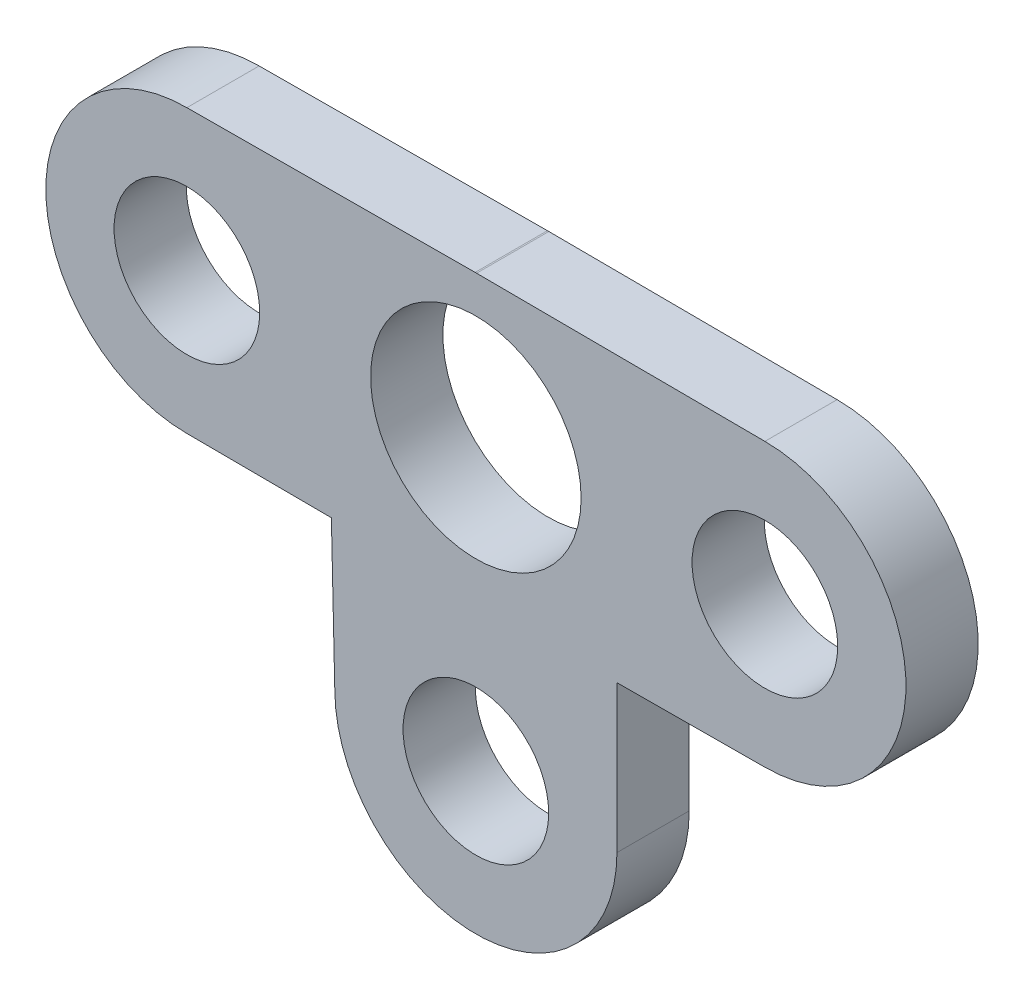
ISO-10303-21;
HEADER;
FILE_DESCRIPTION(('STEP AP214'),'2;1');
FILE_NAME('part.step','',(''),(''),'','','');
FILE_SCHEMA(('AUTOMOTIVE_DESIGN { 1 0 10303 214 1 1 1 1 }'));
ENDSEC;
DATA;
#1=APPLICATION_CONTEXT('core data for automotive mechanical design processes');
#2=APPLICATION_PROTOCOL_DEFINITION('international standard','automotive_design',2000,#1);
#3=PRODUCT_CONTEXT('',#1,'mechanical');
#4=PRODUCT('Part','Part','',(#3));
#5=PRODUCT_RELATED_PRODUCT_CATEGORY('part','',(#4));
#6=PRODUCT_DEFINITION_FORMATION('','',#4);
#7=PRODUCT_DEFINITION_CONTEXT('part definition',#1,'design');
#8=PRODUCT_DEFINITION('design','',#6,#7);
#9=PRODUCT_DEFINITION_SHAPE('','',#8);
#10=(LENGTH_UNIT() NAMED_UNIT(*) SI_UNIT(.MILLI.,.METRE.));
#11=(NAMED_UNIT(*) PLANE_ANGLE_UNIT() SI_UNIT($,.RADIAN.));
#12=(NAMED_UNIT(*) SI_UNIT($,.STERADIAN.) SOLID_ANGLE_UNIT());
#13=UNCERTAINTY_MEASURE_WITH_UNIT(LENGTH_MEASURE(1.E-05),#10,'distance_accuracy_value','');
#14=(GEOMETRIC_REPRESENTATION_CONTEXT(3) GLOBAL_UNCERTAINTY_ASSIGNED_CONTEXT((#13)) GLOBAL_UNIT_ASSIGNED_CONTEXT((#10,
#11,#12)) REPRESENTATION_CONTEXT('',''));
#15=CARTESIAN_POINT('',(0.,0.,0.));
#16=DIRECTION('',(0.,0.,1.));
#17=DIRECTION('',(1.,0.,0.));
#18=AXIS2_PLACEMENT_3D('',#15,#16,#17);
#19=CARTESIAN_POINT('',(-0.0321051201345869,-6.26491773778883,3.175));
#20=DIRECTION('',(-0.00512452037263956,-0.999986869559271,0.));
#21=DIRECTION('',(0.999986869559271,-0.00512452037263956,0.));
#22=AXIS2_PLACEMENT_3D('',#19,#20,#21);
#23=PLANE('',#22);
#24=DIRECTION('',(-0.999986869559271,0.00512452037263957,0.));
#25=VECTOR('',#24,1.);
#26=CARTESIAN_POINT('',(-0.0321051201345869,-6.26491773778883,0.));
#27=LINE('',#26,#25);
#28=CARTESIAN_POINT('',(-6.3500000000002,-6.23254113164566,0.));
#29=VERTEX_POINT('',#28);
#30=CARTESIAN_POINT('',(-12.7,-6.2,0.));
#31=VERTEX_POINT('',#30);
#32=EDGE_CURVE('E174',#29,#31,#27,.T.);
#33=ORIENTED_EDGE('',*,*,#32,.F.);
#34=CARTESIAN_POINT('',(-6.35000000000019,-6.23254113164566,3.175));
#35=DIRECTION('',(0.,0.,-1.));
#36=VECTOR('',#35,1.);
#37=LINE('',#34,#36);
#38=CARTESIAN_POINT('',(-6.3500000000002,-6.23254113164566,3.175));
#39=VERTEX_POINT('',#38);
#40=EDGE_CURVE('E11',#39,#29,#37,.T.);
#41=ORIENTED_EDGE('',*,*,#40,.F.);
#42=DIRECTION('',(-0.999986869559271,0.00512452037263957,0.));
#43=VECTOR('',#42,1.);
#44=CARTESIAN_POINT('',(-0.0321051201345869,-6.26491773778883,3.175));
#45=LINE('',#44,#43);
#46=CARTESIAN_POINT('',(-12.7,-6.2,3.175));
#47=VERTEX_POINT('',#46);
#48=EDGE_CURVE('E227',#39,#47,#45,.T.);
#49=ORIENTED_EDGE('',*,*,#48,.T.);
#50=DIRECTION('',(0.,0.,-1.));
#51=VECTOR('',#50,1.);
#52=CARTESIAN_POINT('',(-12.7,-6.2,3.175));
#53=LINE('',#52,#51);
#54=EDGE_CURVE('E105',#47,#31,#53,.T.);
#55=ORIENTED_EDGE('',*,*,#54,.T.);
#56=EDGE_LOOP('',(#33,#41,#49,#55));
#57=FACE_BOUND('',#56,.T.);
#58=ADVANCED_FACE('F45',(#57),#23,.T.);
#59=CARTESIAN_POINT('',(-6.49105989406454,-0.150547379415907,3.175));
#60=DIRECTION('',(-0.99973115002271,-0.0231867995693576,0.));
#61=DIRECTION('',(0.0231867995693576,-0.99973115002271,0.));
#62=AXIS2_PLACEMENT_3D('',#59,#60,#61);
#63=PLANE('',#62);
#64=DIRECTION('',(-0.0231867995693576,0.99973115002271,0.));
#65=VECTOR('',#64,1.);
#66=CARTESIAN_POINT('',(-6.49105989406454,-0.150547379415907,0.));
#67=LINE('',#66,#65);
#68=CARTESIAN_POINT('',(-6.2,-12.7,0.));
#69=VERTEX_POINT('',#68);
#70=EDGE_CURVE('E178',#69,#29,#67,.T.);
#71=ORIENTED_EDGE('',*,*,#70,.F.);
#72=DIRECTION('',(0.,0.,-1.));
#73=VECTOR('',#72,1.);
#74=CARTESIAN_POINT('',(-6.2,-12.7,3.175));
#75=LINE('',#74,#73);
#76=CARTESIAN_POINT('',(-6.2,-12.7,3.175));
#77=VERTEX_POINT('',#76);
#78=EDGE_CURVE('E57',#77,#69,#75,.T.);
#79=ORIENTED_EDGE('',*,*,#78,.F.);
#80=DIRECTION('',(-0.0231867995693576,0.99973115002271,0.));
#81=VECTOR('',#80,1.);
#82=CARTESIAN_POINT('',(-6.49105989406454,-0.150547379415907,3.175));
#83=LINE('',#82,#81);
#84=EDGE_CURVE('E324',#77,#39,#83,.T.);
#85=ORIENTED_EDGE('',*,*,#84,.T.);
#86=ORIENTED_EDGE('',*,*,#40,.T.);
#87=EDGE_LOOP('',(#71,#79,#85,#86));
#88=FACE_BOUND('',#87,.T.);
#89=ADVANCED_FACE('F257',(#88),#63,.T.);
#90=CARTESIAN_POINT('',(0.,-12.7,3.175));
#91=DIRECTION('',(0.,0.,-1.));
#92=DIRECTION('',(-1.,0.,0.));
#93=AXIS2_PLACEMENT_3D('',#90,#91,#92);
#94=CYLINDRICAL_SURFACE('',#93,6.2);
#95=CARTESIAN_POINT('',(0.,-12.7,0.));
#96=DIRECTION('',(0.,0.,1.));
#97=DIRECTION('',(1.,0.,0.));
#98=AXIS2_PLACEMENT_3D('',#95,#96,#97);
#99=CIRCLE('',#98,6.2);
#100=CARTESIAN_POINT('',(6.2,-12.7,0.));
#101=VERTEX_POINT('',#100);
#102=EDGE_CURVE('E184',#69,#101,#99,.T.);
#103=ORIENTED_EDGE('',*,*,#102,.T.);
#104=DIRECTION('',(0.,0.,-1.));
#105=VECTOR('',#104,1.);
#106=CARTESIAN_POINT('',(6.2,-12.7,3.175));
#107=LINE('',#106,#105);
#108=CARTESIAN_POINT('',(6.2,-12.7,3.175));
#109=VERTEX_POINT('',#108);
#110=EDGE_CURVE('E245',#109,#101,#107,.T.);
#111=ORIENTED_EDGE('',*,*,#110,.F.);
#112=CARTESIAN_POINT('',(0.,-12.7,3.175));
#113=DIRECTION('',(0.,0.,1.));
#114=DIRECTION('',(1.,0.,0.));
#115=AXIS2_PLACEMENT_3D('',#112,#113,#114);
#116=CIRCLE('',#115,6.2);
#117=EDGE_CURVE('E326',#77,#109,#116,.T.);
#118=ORIENTED_EDGE('',*,*,#117,.F.);
#119=ORIENTED_EDGE('',*,*,#78,.T.);
#120=EDGE_LOOP('',(#103,#111,#118,#119));
#121=FACE_BOUND('',#120,.T.);
#122=ADVANCED_FACE('F266',(#121),#94,.T.);
#123=CARTESIAN_POINT('',(6.2,0.,3.175));
#124=DIRECTION('',(-1.,0.,0.));
#125=DIRECTION('',(0.,-1.,0.));
#126=AXIS2_PLACEMENT_3D('',#123,#124,#125);
#127=PLANE('',#126);
#128=DIRECTION('',(0.,1.,0.));
#129=VECTOR('',#128,1.);
#130=CARTESIAN_POINT('',(6.2,0.,0.));
#131=LINE('',#130,#129);
#132=CARTESIAN_POINT('',(6.2,-6.23330981979477,0.));
#133=VERTEX_POINT('',#132);
#134=EDGE_CURVE('E189',#101,#133,#131,.T.);
#135=ORIENTED_EDGE('',*,*,#134,.T.);
#136=DIRECTION('',(0.,0.,-1.));
#137=VECTOR('',#136,1.);
#138=CARTESIAN_POINT('',(6.2,-6.23330981979477,3.175));
#139=LINE('',#138,#137);
#140=CARTESIAN_POINT('',(6.2,-6.23330981979477,3.175));
#141=VERTEX_POINT('',#140);
#142=EDGE_CURVE('E241',#141,#133,#139,.T.);
#143=ORIENTED_EDGE('',*,*,#142,.F.);
#144=DIRECTION('',(0.,1.,0.));
#145=VECTOR('',#144,1.);
#146=CARTESIAN_POINT('',(6.2,0.,3.175));
#147=LINE('',#146,#145);
#148=EDGE_CURVE('E329',#109,#141,#147,.T.);
#149=ORIENTED_EDGE('',*,*,#148,.F.);
#150=ORIENTED_EDGE('',*,*,#110,.T.);
#151=EDGE_LOOP('',(#135,#143,#149,#150));
#152=FACE_BOUND('',#151,.T.);
#153=ADVANCED_FACE('F269',(#152),#127,.F.);
#154=CARTESIAN_POINT('',(0.032105120134585,-6.26491773778883,3.175));
#155=DIRECTION('',(-0.00512452037263926,0.999986869559271,0.));
#156=DIRECTION('',(-0.999986869559271,-0.00512452037263926,0.));
#157=AXIS2_PLACEMENT_3D('',#154,#155,#156);
#158=PLANE('',#157);
#159=DIRECTION('',(0.999986869559271,0.00512452037263926,0.));
#160=VECTOR('',#159,1.);
#161=CARTESIAN_POINT('',(0.032105120134585,-6.26491773778883,0.));
#162=LINE('',#161,#160);
#163=CARTESIAN_POINT('',(12.7,-6.2,0.));
#164=VERTEX_POINT('',#163);
#165=EDGE_CURVE('E192',#133,#164,#162,.T.);
#166=ORIENTED_EDGE('',*,*,#165,.T.);
#167=DIRECTION('',(0.,0.,-1.));
#168=VECTOR('',#167,1.);
#169=CARTESIAN_POINT('',(12.7,-6.2,3.175));
#170=LINE('',#169,#168);
#171=CARTESIAN_POINT('',(12.7,-6.2,3.175));
#172=VERTEX_POINT('',#171);
#173=EDGE_CURVE('E237',#172,#164,#170,.T.);
#174=ORIENTED_EDGE('',*,*,#173,.F.);
#175=DIRECTION('',(0.999986869559271,0.00512452037263926,0.));
#176=VECTOR('',#175,1.);
#177=CARTESIAN_POINT('',(0.032105120134585,-6.26491773778883,3.175));
#178=LINE('',#177,#176);
#179=EDGE_CURVE('E342',#141,#172,#178,.T.);
#180=ORIENTED_EDGE('',*,*,#179,.F.);
#181=ORIENTED_EDGE('',*,*,#142,.T.);
#182=EDGE_LOOP('',(#166,#174,#180,#181));
#183=FACE_BOUND('',#182,.T.);
#184=ADVANCED_FACE('F273',(#183),#158,.F.);
#185=CARTESIAN_POINT('',(12.7,0.,3.175));
#186=DIRECTION('',(0.,0.,-1.));
#187=DIRECTION('',(-1.,0.,0.));
#188=AXIS2_PLACEMENT_3D('',#185,#186,#187);
#189=CYLINDRICAL_SURFACE('',#188,6.2);
#190=CARTESIAN_POINT('',(12.7,0.,0.));
#191=DIRECTION('',(0.,0.,1.));
#192=DIRECTION('',(1.,0.,0.));
#193=AXIS2_PLACEMENT_3D('',#190,#191,#192);
#194=CIRCLE('',#193,6.2);
#195=CARTESIAN_POINT('',(12.7,6.2,0.));
#196=VERTEX_POINT('',#195);
#197=EDGE_CURVE('E195',#164,#196,#194,.T.);
#198=ORIENTED_EDGE('',*,*,#197,.T.);
#199=DIRECTION('',(0.,0.,-1.));
#200=VECTOR('',#199,1.);
#201=CARTESIAN_POINT('',(12.7,6.2,3.175));
#202=LINE('',#201,#200);
#203=CARTESIAN_POINT('',(12.7,6.2,3.175));
#204=VERTEX_POINT('',#203);
#205=EDGE_CURVE('E234',#204,#196,#202,.T.);
#206=ORIENTED_EDGE('',*,*,#205,.F.);
#207=CARTESIAN_POINT('',(12.7,0.,3.175));
#208=DIRECTION('',(0.,0.,1.));
#209=DIRECTION('',(1.,0.,0.));
#210=AXIS2_PLACEMENT_3D('',#207,#208,#209);
#211=CIRCLE('',#210,6.2);
#212=EDGE_CURVE('E345',#172,#204,#211,.T.);
#213=ORIENTED_EDGE('',*,*,#212,.F.);
#214=ORIENTED_EDGE('',*,*,#173,.T.);
#215=EDGE_LOOP('',(#198,#206,#213,#214));
#216=FACE_BOUND('',#215,.T.);
#217=ADVANCED_FACE('F277',(#216),#189,.T.);
#218=CARTESIAN_POINT('',(0.032105120134585,6.26491773778883,3.175));
#219=DIRECTION('',(0.00512452037263926,0.999986869559271,0.));
#220=DIRECTION('',(-0.999986869559271,0.00512452037263926,0.));
#221=AXIS2_PLACEMENT_3D('',#218,#219,#220);
#222=PLANE('',#221);
#223=DIRECTION('',(0.999986869559271,-0.00512452037263926,0.));
#224=VECTOR('',#223,1.);
#225=CARTESIAN_POINT('',(0.032105120134585,6.26491773778883,0.));
#226=LINE('',#225,#224);
#227=CARTESIAN_POINT('',(0.032105120134585,6.26491773778883,0.));
#228=VERTEX_POINT('',#227);
#229=EDGE_CURVE('E199',#228,#196,#226,.T.);
#230=ORIENTED_EDGE('',*,*,#229,.F.);
#231=DIRECTION('',(0.,0.,-1.));
#232=VECTOR('',#231,1.);
#233=CARTESIAN_POINT('',(0.032105120134585,6.26491773778883,3.175));
#234=LINE('',#233,#232);
#235=CARTESIAN_POINT('',(0.032105120134585,6.26491773778883,3.175));
#236=VERTEX_POINT('',#235);
#237=EDGE_CURVE('E149',#236,#228,#234,.T.);
#238=ORIENTED_EDGE('',*,*,#237,.F.);
#239=DIRECTION('',(0.999986869559271,-0.00512452037263926,0.));
#240=VECTOR('',#239,1.);
#241=CARTESIAN_POINT('',(0.032105120134585,6.26491773778883,3.175));
#242=LINE('',#241,#240);
#243=EDGE_CURVE('E136',#236,#204,#242,.T.);
#244=ORIENTED_EDGE('',*,*,#243,.T.);
#245=ORIENTED_EDGE('',*,*,#205,.T.);
#246=EDGE_LOOP('',(#230,#238,#244,#245));
#247=FACE_BOUND('',#246,.T.);
#248=ADVANCED_FACE('F281',(#247),#222,.T.);
#249=CARTESIAN_POINT('',(0.,0.,3.175));
#250=DIRECTION('',(0.,0.,-1.));
#251=DIRECTION('',(-1.,0.,0.));
#252=AXIS2_PLACEMENT_3D('',#249,#250,#251);
#253=CYLINDRICAL_SURFACE('',#252,6.265);
#254=CARTESIAN_POINT('',(0.,0.,0.));
#255=DIRECTION('',(0.,0.,1.));
#256=DIRECTION('',(1.,0.,0.));
#257=AXIS2_PLACEMENT_3D('',#254,#255,#256);
#258=CIRCLE('',#257,6.265);
#259=CARTESIAN_POINT('',(-0.0321051201345869,6.26491773778883,0.));
#260=VERTEX_POINT('',#259);
#261=EDGE_CURVE('E144',#228,#260,#258,.T.);
#262=ORIENTED_EDGE('',*,*,#261,.T.);
#263=DIRECTION('',(0.,0.,-1.));
#264=VECTOR('',#263,1.);
#265=CARTESIAN_POINT('',(-0.0321051201345869,6.26491773778883,3.175));
#266=LINE('',#265,#264);
#267=CARTESIAN_POINT('',(-0.0321051201345869,6.26491773778883,3.175));
#268=VERTEX_POINT('',#267);
#269=EDGE_CURVE('E141',#268,#260,#266,.T.);
#270=ORIENTED_EDGE('',*,*,#269,.F.);
#271=CARTESIAN_POINT('',(0.,0.,3.175));
#272=DIRECTION('',(0.,0.,1.));
#273=DIRECTION('',(1.,0.,0.));
#274=AXIS2_PLACEMENT_3D('',#271,#272,#273);
#275=CIRCLE('',#274,6.265);
#276=EDGE_CURVE('E129',#236,#268,#275,.T.);
#277=ORIENTED_EDGE('',*,*,#276,.F.);
#278=ORIENTED_EDGE('',*,*,#237,.T.);
#279=EDGE_LOOP('',(#262,#270,#277,#278));
#280=FACE_BOUND('',#279,.T.);
#281=ADVANCED_FACE('F142',(#280),#253,.T.);
#282=CARTESIAN_POINT('',(-0.0321051201345869,6.26491773778883,3.175));
#283=DIRECTION('',(-0.00512452037263956,0.999986869559271,0.));
#284=DIRECTION('',(-0.999986869559271,-0.00512452037263956,0.));
#285=AXIS2_PLACEMENT_3D('',#282,#283,#284);
#286=PLANE('',#285);
#287=DIRECTION('',(0.999986869559271,0.00512452037263957,0.));
#288=VECTOR('',#287,1.);
#289=CARTESIAN_POINT('',(-0.0321051201345869,6.26491773778883,0.));
#290=LINE('',#289,#288);
#291=CARTESIAN_POINT('',(-12.7,6.2,0.));
#292=VERTEX_POINT('',#291);
#293=EDGE_CURVE('E205',#292,#260,#290,.T.);
#294=ORIENTED_EDGE('',*,*,#293,.F.);
#295=DIRECTION('',(0.,0.,-1.));
#296=VECTOR('',#295,1.);
#297=CARTESIAN_POINT('',(-12.7,6.2,3.175));
#298=LINE('',#297,#296);
#299=CARTESIAN_POINT('',(-12.7,6.2,3.175));
#300=VERTEX_POINT('',#299);
#301=EDGE_CURVE('E98',#300,#292,#298,.T.);
#302=ORIENTED_EDGE('',*,*,#301,.F.);
#303=DIRECTION('',(0.999986869559271,0.00512452037263957,0.));
#304=VECTOR('',#303,1.);
#305=CARTESIAN_POINT('',(-0.0321051201345869,6.26491773778883,3.175));
#306=LINE('',#305,#304);
#307=EDGE_CURVE('E134',#300,#268,#306,.T.);
#308=ORIENTED_EDGE('',*,*,#307,.T.);
#309=ORIENTED_EDGE('',*,*,#269,.T.);
#310=EDGE_LOOP('',(#294,#302,#308,#309));
#311=FACE_BOUND('',#310,.T.);
#312=ADVANCED_FACE('F151',(#311),#286,.T.);
#313=CARTESIAN_POINT('',(-12.7,0.,3.175));
#314=DIRECTION('',(0.,0.,-1.));
#315=DIRECTION('',(-1.,0.,0.));
#316=AXIS2_PLACEMENT_3D('',#313,#314,#315);
#317=CYLINDRICAL_SURFACE('',#316,3.2);
#318=CARTESIAN_POINT('',(-12.7,0.,3.175));
#319=DIRECTION('',(0.,0.,1.));
#320=DIRECTION('',(1.,0.,0.));
#321=AXIS2_PLACEMENT_3D('',#318,#319,#320);
#322=CIRCLE('',#321,3.2);
#323=CARTESIAN_POINT('',(-9.5,0.,3.175));
#324=VERTEX_POINT('',#323);
#325=EDGE_CURVE('E166',#324,#324,#322,.T.);
#326=ORIENTED_EDGE('',*,*,#325,.T.);
#327=EDGE_LOOP('',(#326));
#328=FACE_BOUND('',#327,.T.);
#329=CARTESIAN_POINT('',(-12.7,0.,0.));
#330=DIRECTION('',(0.,0.,1.));
#331=DIRECTION('',(1.,0.,0.));
#332=AXIS2_PLACEMENT_3D('',#329,#330,#331);
#333=CIRCLE('',#332,3.2);
#334=CARTESIAN_POINT('',(-9.5,0.,0.));
#335=VERTEX_POINT('',#334);
#336=EDGE_CURVE('E219',#335,#335,#333,.T.);
#337=ORIENTED_EDGE('',*,*,#336,.F.);
#338=EDGE_LOOP('',(#337));
#339=FACE_BOUND('',#338,.T.);
#340=ADVANCED_FACE('F290',(#328,#339),#317,.F.);
#341=CARTESIAN_POINT('',(0.,0.,3.175));
#342=DIRECTION('',(0.,0.,-1.));
#343=DIRECTION('',(-1.,0.,0.));
#344=AXIS2_PLACEMENT_3D('',#341,#342,#343);
#345=CYLINDRICAL_SURFACE('',#344,4.625);
#346=CARTESIAN_POINT('',(0.,0.,3.175));
#347=DIRECTION('',(0.,0.,1.));
#348=DIRECTION('',(1.,0.,0.));
#349=AXIS2_PLACEMENT_3D('',#346,#347,#348);
#350=CIRCLE('',#349,4.625);
#351=CARTESIAN_POINT('',(4.625,0.,3.175));
#352=VERTEX_POINT('',#351);
#353=EDGE_CURVE('E162',#352,#352,#350,.T.);
#354=ORIENTED_EDGE('',*,*,#353,.T.);
#355=EDGE_LOOP('',(#354));
#356=FACE_BOUND('',#355,.T.);
#357=CARTESIAN_POINT('',(0.,0.,0.));
#358=DIRECTION('',(0.,0.,1.));
#359=DIRECTION('',(1.,0.,0.));
#360=AXIS2_PLACEMENT_3D('',#357,#358,#359);
#361=CIRCLE('',#360,4.625);
#362=CARTESIAN_POINT('',(4.625,0.,0.));
#363=VERTEX_POINT('',#362);
#364=EDGE_CURVE('E215',#363,#363,#361,.T.);
#365=ORIENTED_EDGE('',*,*,#364,.F.);
#366=EDGE_LOOP('',(#365));
#367=FACE_BOUND('',#366,.T.);
#368=ADVANCED_FACE('F298',(#356,#367),#345,.F.);
#369=CARTESIAN_POINT('',(12.7,0.,3.175));
#370=DIRECTION('',(0.,0.,-1.));
#371=DIRECTION('',(-1.,0.,0.));
#372=AXIS2_PLACEMENT_3D('',#369,#370,#371);
#373=CYLINDRICAL_SURFACE('',#372,3.2);
#374=CARTESIAN_POINT('',(12.7,0.,3.175));
#375=DIRECTION('',(0.,0.,1.));
#376=DIRECTION('',(1.,0.,0.));
#377=AXIS2_PLACEMENT_3D('',#374,#375,#376);
#378=CIRCLE('',#377,3.2);
#379=CARTESIAN_POINT('',(15.9,0.,3.175));
#380=VERTEX_POINT('',#379);
#381=EDGE_CURVE('E155',#380,#380,#378,.T.);
#382=ORIENTED_EDGE('',*,*,#381,.T.);
#383=EDGE_LOOP('',(#382));
#384=FACE_BOUND('',#383,.T.);
#385=CARTESIAN_POINT('',(12.7,0.,0.));
#386=DIRECTION('',(0.,0.,1.));
#387=DIRECTION('',(1.,0.,0.));
#388=AXIS2_PLACEMENT_3D('',#385,#386,#387);
#389=CIRCLE('',#388,3.2);
#390=CARTESIAN_POINT('',(15.9,0.,0.));
#391=VERTEX_POINT('',#390);
#392=EDGE_CURVE('E211',#391,#391,#389,.T.);
#393=ORIENTED_EDGE('',*,*,#392,.F.);
#394=EDGE_LOOP('',(#393));
#395=FACE_BOUND('',#394,.T.);
#396=ADVANCED_FACE('F295',(#384,#395),#373,.F.);
#397=CARTESIAN_POINT('',(-12.7,0.,3.175));
#398=DIRECTION('',(0.,0.,-1.));
#399=DIRECTION('',(-1.,0.,0.));
#400=AXIS2_PLACEMENT_3D('',#397,#398,#399);
#401=CYLINDRICAL_SURFACE('',#400,6.2);
#402=CARTESIAN_POINT('',(-12.7,0.,0.));
#403=DIRECTION('',(0.,0.,1.));
#404=DIRECTION('',(1.,0.,0.));
#405=AXIS2_PLACEMENT_3D('',#402,#403,#404);
#406=CIRCLE('',#405,6.2);
#407=EDGE_CURVE('E208',#292,#31,#406,.T.);
#408=ORIENTED_EDGE('',*,*,#407,.T.);
#409=ORIENTED_EDGE('',*,*,#54,.F.);
#410=CARTESIAN_POINT('',(-12.7,0.,3.175));
#411=DIRECTION('',(0.,0.,1.));
#412=DIRECTION('',(1.,0.,0.));
#413=AXIS2_PLACEMENT_3D('',#410,#411,#412);
#414=CIRCLE('',#413,6.2);
#415=EDGE_CURVE('E65',#300,#47,#414,.T.);
#416=ORIENTED_EDGE('',*,*,#415,.F.);
#417=ORIENTED_EDGE('',*,*,#301,.T.);
#418=EDGE_LOOP('',(#408,#409,#416,#417));
#419=FACE_BOUND('',#418,.T.);
#420=ADVANCED_FACE('F291',(#419),#401,.T.);
#421=CARTESIAN_POINT('',(0.,-12.7,3.175));
#422=DIRECTION('',(0.,0.,-1.));
#423=DIRECTION('',(-1.,0.,0.));
#424=AXIS2_PLACEMENT_3D('',#421,#422,#423);
#425=CYLINDRICAL_SURFACE('',#424,3.2);
#426=CARTESIAN_POINT('',(0.,-12.7,3.175));
#427=DIRECTION('',(0.,0.,1.));
#428=DIRECTION('',(1.,0.,0.));
#429=AXIS2_PLACEMENT_3D('',#426,#427,#428);
#430=CIRCLE('',#429,3.2);
#431=CARTESIAN_POINT('',(3.2,-12.7,3.175));
#432=VERTEX_POINT('',#431);
#433=EDGE_CURVE('E170',#432,#432,#430,.T.);
#434=ORIENTED_EDGE('',*,*,#433,.T.);
#435=EDGE_LOOP('',(#434));
#436=FACE_BOUND('',#435,.T.);
#437=CARTESIAN_POINT('',(0.,-12.7,0.));
#438=DIRECTION('',(0.,0.,1.));
#439=DIRECTION('',(1.,0.,0.));
#440=AXIS2_PLACEMENT_3D('',#437,#438,#439);
#441=CIRCLE('',#440,3.2);
#442=CARTESIAN_POINT('',(3.2,-12.7,0.));
#443=VERTEX_POINT('',#442);
#444=EDGE_CURVE('E223',#443,#443,#441,.T.);
#445=ORIENTED_EDGE('',*,*,#444,.F.);
#446=EDGE_LOOP('',(#445));
#447=FACE_BOUND('',#446,.T.);
#448=ADVANCED_FACE('F294',(#436,#447),#425,.F.);
#449=CARTESIAN_POINT('',(0.,0.,3.175));
#450=DIRECTION('',(0.,0.,1.));
#451=DIRECTION('',(1.,0.,0.));
#452=AXIS2_PLACEMENT_3D('',#449,#450,#451);
#453=PLANE('',#452);
#454=ORIENTED_EDGE('',*,*,#48,.F.);
#455=ORIENTED_EDGE('',*,*,#84,.F.);
#456=ORIENTED_EDGE('',*,*,#117,.T.);
#457=ORIENTED_EDGE('',*,*,#148,.T.);
#458=ORIENTED_EDGE('',*,*,#179,.T.);
#459=ORIENTED_EDGE('',*,*,#212,.T.);
#460=ORIENTED_EDGE('',*,*,#243,.F.);
#461=ORIENTED_EDGE('',*,*,#276,.T.);
#462=ORIENTED_EDGE('',*,*,#307,.F.);
#463=ORIENTED_EDGE('',*,*,#415,.T.);
#464=EDGE_LOOP('',(#454,#455,#456,#457,#458,#459,#460,#461,#462,#463));
#465=FACE_BOUND('',#464,.T.);
#466=ORIENTED_EDGE('',*,*,#381,.F.);
#467=EDGE_LOOP('',(#466));
#468=FACE_BOUND('',#467,.T.);
#469=ORIENTED_EDGE('',*,*,#353,.F.);
#470=EDGE_LOOP('',(#469));
#471=FACE_BOUND('',#470,.T.);
#472=ORIENTED_EDGE('',*,*,#325,.F.);
#473=EDGE_LOOP('',(#472));
#474=FACE_BOUND('',#473,.T.);
#475=ORIENTED_EDGE('',*,*,#433,.F.);
#476=EDGE_LOOP('',(#475));
#477=FACE_BOUND('',#476,.T.);
#478=ADVANCED_FACE('F131',(#465,#468,#471,#474,#477),#453,.T.);
#479=CARTESIAN_POINT('',(0.,0.,0.));
#480=DIRECTION('',(0.,0.,1.));
#481=DIRECTION('',(1.,0.,0.));
#482=AXIS2_PLACEMENT_3D('',#479,#480,#481);
#483=PLANE('',#482);
#484=ORIENTED_EDGE('',*,*,#32,.T.);
#485=ORIENTED_EDGE('',*,*,#407,.F.);
#486=ORIENTED_EDGE('',*,*,#293,.T.);
#487=ORIENTED_EDGE('',*,*,#261,.F.);
#488=ORIENTED_EDGE('',*,*,#229,.T.);
#489=ORIENTED_EDGE('',*,*,#197,.F.);
#490=ORIENTED_EDGE('',*,*,#165,.F.);
#491=ORIENTED_EDGE('',*,*,#134,.F.);
#492=ORIENTED_EDGE('',*,*,#102,.F.);
#493=ORIENTED_EDGE('',*,*,#70,.T.);
#494=EDGE_LOOP('',(#484,#485,#486,#487,#488,#489,#490,#491,#492,#493));
#495=FACE_BOUND('',#494,.T.);
#496=ORIENTED_EDGE('',*,*,#392,.T.);
#497=EDGE_LOOP('',(#496));
#498=FACE_BOUND('',#497,.T.);
#499=ORIENTED_EDGE('',*,*,#364,.T.);
#500=EDGE_LOOP('',(#499));
#501=FACE_BOUND('',#500,.T.);
#502=ORIENTED_EDGE('',*,*,#336,.T.);
#503=EDGE_LOOP('',(#502));
#504=FACE_BOUND('',#503,.T.);
#505=ORIENTED_EDGE('',*,*,#444,.T.);
#506=EDGE_LOOP('',(#505));
#507=FACE_BOUND('',#506,.T.);
#508=ADVANCED_FACE('F309',(#495,#498,#501,#504,#507),#483,.F.);
#509=CLOSED_SHELL('',(#58,#89,#122,#153,#184,#217,#248,#281,#312,#340,#368,#396,#420,#448,#478,#508));
#510=MANIFOLD_SOLID_BREP('B2',#509);
#511=ADVANCED_BREP_SHAPE_REPRESENTATION('',(#18,#510),#14);
#512=SHAPE_DEFINITION_REPRESENTATION(#9,#511);
ENDSEC;
END-ISO-10303-21;
